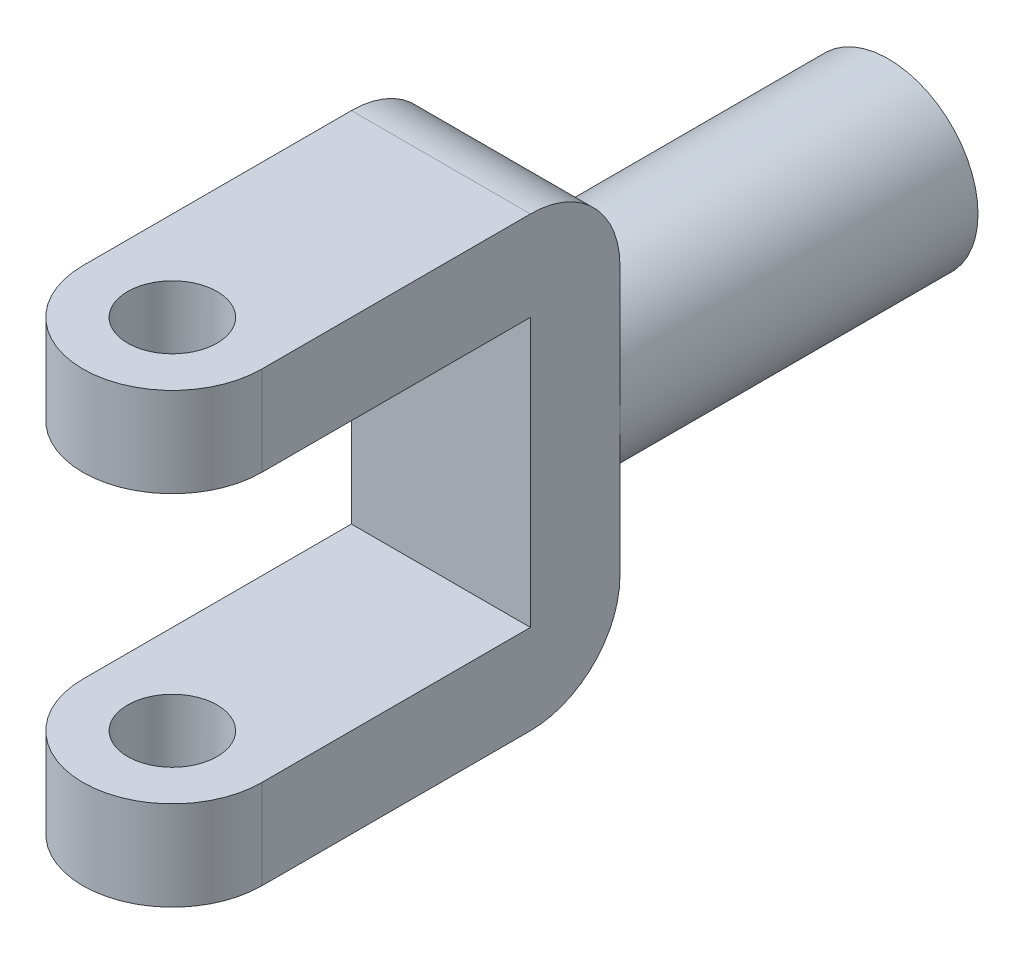
ISO-10303-21;
HEADER;
FILE_DESCRIPTION(('STEP AP214'),'2;1');
FILE_NAME('part.step','',(''),(''),'','','');
FILE_SCHEMA(('AUTOMOTIVE_DESIGN { 1 0 10303 214 1 1 1 1 }'));
ENDSEC;
DATA;
#1=APPLICATION_CONTEXT('core data for automotive mechanical design processes');
#2=APPLICATION_PROTOCOL_DEFINITION('international standard','automotive_design',2000,#1);
#3=PRODUCT_CONTEXT('',#1,'mechanical');
#4=PRODUCT('Part','Part','',(#3));
#5=PRODUCT_RELATED_PRODUCT_CATEGORY('part','',(#4));
#6=PRODUCT_DEFINITION_FORMATION('','',#4);
#7=PRODUCT_DEFINITION_CONTEXT('part definition',#1,'design');
#8=PRODUCT_DEFINITION('design','',#6,#7);
#9=PRODUCT_DEFINITION_SHAPE('','',#8);
#10=(LENGTH_UNIT() NAMED_UNIT(*) SI_UNIT(.MILLI.,.METRE.));
#11=(NAMED_UNIT(*) PLANE_ANGLE_UNIT() SI_UNIT($,.RADIAN.));
#12=(NAMED_UNIT(*) SI_UNIT($,.STERADIAN.) SOLID_ANGLE_UNIT());
#13=UNCERTAINTY_MEASURE_WITH_UNIT(LENGTH_MEASURE(1.E-05),#10,'distance_accuracy_value','');
#14=(GEOMETRIC_REPRESENTATION_CONTEXT(3) GLOBAL_UNCERTAINTY_ASSIGNED_CONTEXT((#13)) GLOBAL_UNIT_ASSIGNED_CONTEXT((#10,
#11,#12)) REPRESENTATION_CONTEXT('',''));
#15=CARTESIAN_POINT('',(0.,0.,0.));
#16=DIRECTION('',(0.,0.,1.));
#17=DIRECTION('',(1.,0.,0.));
#18=AXIS2_PLACEMENT_3D('',#15,#16,#17);
#19=CARTESIAN_POINT('',(5.,-7.5,25.));
#20=DIRECTION('',(-1.,0.,0.));
#21=DIRECTION('',(0.,0.,1.));
#22=AXIS2_PLACEMENT_3D('',#19,#20,#21);
#23=CYLINDRICAL_SURFACE('',#22,5.);
#24=DIRECTION('',(1.,0.,0.));
#25=VECTOR('',#24,1.);
#26=CARTESIAN_POINT('',(5.,-12.5,25.));
#27=LINE('',#26,#25);
#28=CARTESIAN_POINT('',(-5.,-12.5,25.));
#29=VERTEX_POINT('',#28);
#30=CARTESIAN_POINT('',(5.,-12.5,25.));
#31=VERTEX_POINT('',#30);
#32=EDGE_CURVE('E249',#29,#31,#27,.T.);
#33=ORIENTED_EDGE('',*,*,#32,.F.);
#34=CARTESIAN_POINT('',(-5.,-7.5,25.));
#35=DIRECTION('',(1.,0.,0.));
#36=DIRECTION('',(0.,0.,-1.));
#37=AXIS2_PLACEMENT_3D('',#34,#35,#36);
#38=CIRCLE('',#37,5.);
#39=CARTESIAN_POINT('',(-5.,-7.5,20.));
#40=VERTEX_POINT('',#39);
#41=EDGE_CURVE('E55',#40,#29,#38,.F.);
#42=ORIENTED_EDGE('',*,*,#41,.F.);
#43=DIRECTION('',(1.,0.,0.));
#44=VECTOR('',#43,1.);
#45=CARTESIAN_POINT('',(5.,-7.5,20.));
#46=LINE('',#45,#44);
#47=CARTESIAN_POINT('',(5.,-7.5,20.));
#48=VERTEX_POINT('',#47);
#49=EDGE_CURVE('E253',#48,#40,#46,.F.);
#50=ORIENTED_EDGE('',*,*,#49,.F.);
#51=CARTESIAN_POINT('',(5.,-7.5,25.));
#52=DIRECTION('',(-1.,0.,0.));
#53=DIRECTION('',(0.,-1.,0.));
#54=AXIS2_PLACEMENT_3D('',#51,#52,#53);
#55=CIRCLE('',#54,5.);
#56=EDGE_CURVE('E11',#31,#48,#55,.F.);
#57=ORIENTED_EDGE('',*,*,#56,.F.);
#58=EDGE_LOOP('',(#33,#42,#50,#57));
#59=FACE_BOUND('',#58,.T.);
#60=ADVANCED_FACE('F47',(#59),#23,.T.);
#61=CARTESIAN_POINT('',(-5.,7.5,25.));
#62=DIRECTION('',(1.,0.,0.));
#63=DIRECTION('',(0.,1.,0.));
#64=AXIS2_PLACEMENT_3D('',#61,#62,#63);
#65=CYLINDRICAL_SURFACE('',#64,5.);
#66=DIRECTION('',(-1.,0.,0.));
#67=VECTOR('',#66,1.);
#68=CARTESIAN_POINT('',(-5.,12.5,25.));
#69=LINE('',#68,#67);
#70=CARTESIAN_POINT('',(5.,12.5,25.));
#71=VERTEX_POINT('',#70);
#72=CARTESIAN_POINT('',(-5.,12.5,25.));
#73=VERTEX_POINT('',#72);
#74=EDGE_CURVE('E235',#71,#73,#69,.T.);
#75=ORIENTED_EDGE('',*,*,#74,.F.);
#76=CARTESIAN_POINT('',(5.,7.5,25.));
#77=DIRECTION('',(-1.,0.,0.));
#78=DIRECTION('',(0.,-1.,0.));
#79=AXIS2_PLACEMENT_3D('',#76,#77,#78);
#80=CIRCLE('',#79,5.);
#81=CARTESIAN_POINT('',(5.,7.5,20.));
#82=VERTEX_POINT('',#81);
#83=EDGE_CURVE('E243',#82,#71,#80,.F.);
#84=ORIENTED_EDGE('',*,*,#83,.F.);
#85=DIRECTION('',(-1.,0.,0.));
#86=VECTOR('',#85,1.);
#87=CARTESIAN_POINT('',(-5.,7.5,20.));
#88=LINE('',#87,#86);
#89=CARTESIAN_POINT('',(-5.,7.5,20.));
#90=VERTEX_POINT('',#89);
#91=EDGE_CURVE('E239',#90,#82,#88,.F.);
#92=ORIENTED_EDGE('',*,*,#91,.F.);
#93=CARTESIAN_POINT('',(-5.,7.5,25.));
#94=DIRECTION('',(1.,0.,0.));
#95=DIRECTION('',(0.,0.,-1.));
#96=AXIS2_PLACEMENT_3D('',#93,#94,#95);
#97=CIRCLE('',#96,5.);
#98=EDGE_CURVE('E246',#73,#90,#97,.F.);
#99=ORIENTED_EDGE('',*,*,#98,.F.);
#100=EDGE_LOOP('',(#75,#84,#92,#99));
#101=FACE_BOUND('',#100,.T.);
#102=ADVANCED_FACE('F290',(#101),#65,.T.);
#103=CARTESIAN_POINT('',(0.,-7.5,40.));
#104=DIRECTION('',(0.,1.,0.));
#105=DIRECTION('',(-1.,0.,0.));
#106=AXIS2_PLACEMENT_3D('',#103,#104,#105);
#107=CYLINDRICAL_SURFACE('',#106,5.);
#108=DIRECTION('',(0.,1.,0.));
#109=VECTOR('',#108,1.);
#110=CARTESIAN_POINT('',(5.,12.5,40.));
#111=LINE('',#110,#109);
#112=CARTESIAN_POINT('',(5.,-7.5,40.));
#113=VERTEX_POINT('',#112);
#114=CARTESIAN_POINT('',(5.,-12.5,40.));
#115=VERTEX_POINT('',#114);
#116=EDGE_CURVE('E221',#113,#115,#111,.F.);
#117=ORIENTED_EDGE('',*,*,#116,.F.);
#118=CARTESIAN_POINT('',(0.,-7.5,40.));
#119=DIRECTION('',(0.,-1.,0.));
#120=DIRECTION('',(0.,0.,-1.));
#121=AXIS2_PLACEMENT_3D('',#118,#119,#120);
#122=CIRCLE('',#121,5.);
#123=CARTESIAN_POINT('',(-5.,-7.5,40.));
#124=VERTEX_POINT('',#123);
#125=EDGE_CURVE('E229',#124,#113,#122,.F.);
#126=ORIENTED_EDGE('',*,*,#125,.F.);
#127=DIRECTION('',(0.,1.,0.));
#128=VECTOR('',#127,1.);
#129=CARTESIAN_POINT('',(-5.,0.,40.));
#130=LINE('',#129,#128);
#131=CARTESIAN_POINT('',(-5.,-12.5,40.));
#132=VERTEX_POINT('',#131);
#133=EDGE_CURVE('E225',#132,#124,#130,.T.);
#134=ORIENTED_EDGE('',*,*,#133,.F.);
#135=CARTESIAN_POINT('',(0.,-12.5,40.));
#136=DIRECTION('',(0.,1.,0.));
#137=DIRECTION('',(0.,0.,1.));
#138=AXIS2_PLACEMENT_3D('',#135,#136,#137);
#139=CIRCLE('',#138,5.);
#140=EDGE_CURVE('E232',#115,#132,#139,.F.);
#141=ORIENTED_EDGE('',*,*,#140,.F.);
#142=EDGE_LOOP('',(#117,#126,#134,#141));
#143=FACE_BOUND('',#142,.T.);
#144=ADVANCED_FACE('F267',(#143),#107,.T.);
#145=CARTESIAN_POINT('',(0.,12.5,40.));
#146=DIRECTION('',(0.,1.,0.));
#147=DIRECTION('',(-1.,0.,0.));
#148=AXIS2_PLACEMENT_3D('',#145,#146,#147);
#149=CYLINDRICAL_SURFACE('',#148,5.);
#150=DIRECTION('',(0.,-1.,0.));
#151=VECTOR('',#150,1.);
#152=CARTESIAN_POINT('',(5.,12.5,40.));
#153=LINE('',#152,#151);
#154=CARTESIAN_POINT('',(5.,12.5,40.));
#155=VERTEX_POINT('',#154);
#156=CARTESIAN_POINT('',(5.,7.5,40.));
#157=VERTEX_POINT('',#156);
#158=EDGE_CURVE('E134',#155,#157,#153,.T.);
#159=ORIENTED_EDGE('',*,*,#158,.F.);
#160=CARTESIAN_POINT('',(0.,12.5,40.));
#161=DIRECTION('',(0.,-1.,0.));
#162=DIRECTION('',(1.,0.,0.));
#163=AXIS2_PLACEMENT_3D('',#160,#161,#162);
#164=CIRCLE('',#163,5.);
#165=CARTESIAN_POINT('',(-5.,12.5,40.));
#166=VERTEX_POINT('',#165);
#167=EDGE_CURVE('E215',#166,#155,#164,.F.);
#168=ORIENTED_EDGE('',*,*,#167,.F.);
#169=DIRECTION('',(0.,-1.,0.));
#170=VECTOR('',#169,1.);
#171=CARTESIAN_POINT('',(-5.,12.5,40.));
#172=LINE('',#171,#170);
#173=CARTESIAN_POINT('',(-5.,7.5,40.));
#174=VERTEX_POINT('',#173);
#175=EDGE_CURVE('E211',#174,#166,#172,.F.);
#176=ORIENTED_EDGE('',*,*,#175,.F.);
#177=CARTESIAN_POINT('',(0.,7.5,40.));
#178=DIRECTION('',(0.,1.,0.));
#179=DIRECTION('',(0.,0.,1.));
#180=AXIS2_PLACEMENT_3D('',#177,#178,#179);
#181=CIRCLE('',#180,5.);
#182=EDGE_CURVE('E218',#157,#174,#181,.F.);
#183=ORIENTED_EDGE('',*,*,#182,.F.);
#184=EDGE_LOOP('',(#159,#168,#176,#183));
#185=FACE_BOUND('',#184,.T.);
#186=ADVANCED_FACE('F299',(#185),#149,.T.);
#187=CARTESIAN_POINT('',(0.,0.,25.));
#188=DIRECTION('',(0.,0.,-1.));
#189=DIRECTION('',(-1.,0.,0.));
#190=AXIS2_PLACEMENT_3D('',#187,#188,#189);
#191=PLANE('',#190);
#192=DIRECTION('',(1.,0.,0.));
#193=VECTOR('',#192,1.);
#194=CARTESIAN_POINT('',(-5.,7.5,25.));
#195=LINE('',#194,#193);
#196=CARTESIAN_POINT('',(-5.,7.5,25.));
#197=VERTEX_POINT('',#196);
#198=CARTESIAN_POINT('',(5.,7.5,25.));
#199=VERTEX_POINT('',#198);
#200=EDGE_CURVE('E139',#197,#199,#195,.T.);
#201=ORIENTED_EDGE('',*,*,#200,.F.);
#202=DIRECTION('',(0.,-1.,0.));
#203=VECTOR('',#202,1.);
#204=CARTESIAN_POINT('',(-5.,-12.5,25.));
#205=LINE('',#204,#203);
#206=CARTESIAN_POINT('',(-5.,-7.5,25.));
#207=VERTEX_POINT('',#206);
#208=EDGE_CURVE('E151',#197,#207,#205,.T.);
#209=ORIENTED_EDGE('',*,*,#208,.T.);
#210=DIRECTION('',(-1.,0.,0.));
#211=VECTOR('',#210,1.);
#212=CARTESIAN_POINT('',(-5.,-7.5,25.));
#213=LINE('',#212,#211);
#214=CARTESIAN_POINT('',(5.,-7.5,25.));
#215=VERTEX_POINT('',#214);
#216=EDGE_CURVE('E148',#215,#207,#213,.T.);
#217=ORIENTED_EDGE('',*,*,#216,.F.);
#218=DIRECTION('',(0.,1.,0.));
#219=VECTOR('',#218,1.);
#220=CARTESIAN_POINT('',(5.,12.5,25.));
#221=LINE('',#220,#219);
#222=EDGE_CURVE('E131',#215,#199,#221,.T.);
#223=ORIENTED_EDGE('',*,*,#222,.T.);
#224=EDGE_LOOP('',(#201,#209,#217,#223));
#225=FACE_BOUND('',#224,.T.);
#226=ADVANCED_FACE('F144',(#225),#191,.F.);
#227=CARTESIAN_POINT('',(0.,0.,20.));
#228=DIRECTION('',(0.,0.,-1.));
#229=DIRECTION('',(-1.,0.,0.));
#230=AXIS2_PLACEMENT_3D('',#227,#228,#229);
#231=CYLINDRICAL_SURFACE('',#230,5.);
#232=CARTESIAN_POINT('',(0.,0.,20.));
#233=DIRECTION('',(0.,0.,1.));
#234=DIRECTION('',(1.,0.,0.));
#235=AXIS2_PLACEMENT_3D('',#232,#233,#234);
#236=CIRCLE('',#235,5.);
#237=CARTESIAN_POINT('',(5.,0.,20.));
#238=VERTEX_POINT('',#237);
#239=CARTESIAN_POINT('',(-5.,0.,20.));
#240=VERTEX_POINT('',#239);
#241=EDGE_CURVE('E196',#238,#240,#236,.T.);
#242=ORIENTED_EDGE('',*,*,#241,.F.);
#243=EDGE_CURVE('E200',#240,#238,#236,.T.);
#244=ORIENTED_EDGE('',*,*,#243,.F.);
#245=EDGE_LOOP('',(#242,#244));
#246=FACE_BOUND('',#245,.T.);
#247=CARTESIAN_POINT('',(0.,0.,0.));
#248=DIRECTION('',(0.,0.,1.));
#249=DIRECTION('',(1.,0.,0.));
#250=AXIS2_PLACEMENT_3D('',#247,#248,#249);
#251=CIRCLE('',#250,5.);
#252=CARTESIAN_POINT('',(5.,0.,0.));
#253=VERTEX_POINT('',#252);
#254=EDGE_CURVE('E195',#253,#253,#251,.T.);
#255=ORIENTED_EDGE('',*,*,#254,.T.);
#256=EDGE_LOOP('',(#255));
#257=FACE_BOUND('',#256,.T.);
#258=ADVANCED_FACE('F312',(#246,#257),#231,.T.);
#259=CARTESIAN_POINT('',(0.,0.,0.));
#260=DIRECTION('',(0.,0.,1.));
#261=DIRECTION('',(1.,0.,0.));
#262=AXIS2_PLACEMENT_3D('',#259,#260,#261);
#263=PLANE('',#262);
#264=ORIENTED_EDGE('',*,*,#254,.F.);
#265=EDGE_LOOP('',(#264));
#266=FACE_BOUND('',#265,.T.);
#267=ADVANCED_FACE('F315',(#266),#263,.F.);
#268=CARTESIAN_POINT('',(0.,0.,20.));
#269=DIRECTION('',(0.,0.,-1.));
#270=DIRECTION('',(-1.,0.,0.));
#271=AXIS2_PLACEMENT_3D('',#268,#269,#270);
#272=PLANE('',#271);
#273=DIRECTION('',(0.,-1.,0.));
#274=VECTOR('',#273,1.);
#275=CARTESIAN_POINT('',(-5.,0.,20.));
#276=LINE('',#275,#274);
#277=EDGE_CURVE('E173',#90,#240,#276,.T.);
#278=ORIENTED_EDGE('',*,*,#277,.F.);
#279=ORIENTED_EDGE('',*,*,#91,.T.);
#280=DIRECTION('',(0.,1.,0.));
#281=VECTOR('',#280,1.);
#282=CARTESIAN_POINT('',(5.,12.5,20.));
#283=LINE('',#282,#281);
#284=EDGE_CURVE('E166',#238,#82,#283,.T.);
#285=ORIENTED_EDGE('',*,*,#284,.F.);
#286=ORIENTED_EDGE('',*,*,#241,.T.);
#287=EDGE_LOOP('',(#278,#279,#285,#286));
#288=FACE_BOUND('',#287,.T.);
#289=ADVANCED_FACE('F286',(#288),#272,.T.);
#290=CARTESIAN_POINT('',(5.,-12.5,25.));
#291=DIRECTION('',(0.,1.,0.));
#292=DIRECTION('',(0.,0.,1.));
#293=AXIS2_PLACEMENT_3D('',#290,#291,#292);
#294=PLANE('',#293);
#295=CARTESIAN_POINT('',(0.,-12.5,40.));
#296=DIRECTION('',(0.,1.,0.));
#297=DIRECTION('',(-1.,0.,0.));
#298=AXIS2_PLACEMENT_3D('',#295,#296,#297);
#299=CIRCLE('',#298,2.5);
#300=CARTESIAN_POINT('',(-2.5,-12.5,40.));
#301=VERTEX_POINT('',#300);
#302=EDGE_CURVE('E208',#301,#301,#299,.T.);
#303=ORIENTED_EDGE('',*,*,#302,.T.);
#304=EDGE_LOOP('',(#303));
#305=FACE_BOUND('',#304,.T.);
#306=DIRECTION('',(0.,0.,-1.));
#307=VECTOR('',#306,1.);
#308=CARTESIAN_POINT('',(-5.,-12.5,25.));
#309=LINE('',#308,#307);
#310=EDGE_CURVE('E191',#132,#29,#309,.T.);
#311=ORIENTED_EDGE('',*,*,#310,.T.);
#312=ORIENTED_EDGE('',*,*,#32,.T.);
#313=DIRECTION('',(0.,0.,-1.));
#314=VECTOR('',#313,1.);
#315=CARTESIAN_POINT('',(5.,-12.5,25.));
#316=LINE('',#315,#314);
#317=EDGE_CURVE('E188',#115,#31,#316,.T.);
#318=ORIENTED_EDGE('',*,*,#317,.F.);
#319=ORIENTED_EDGE('',*,*,#140,.T.);
#320=EDGE_LOOP('',(#311,#312,#318,#319));
#321=FACE_BOUND('',#320,.T.);
#322=ADVANCED_FACE('F263',(#305,#321),#294,.F.);
#323=CARTESIAN_POINT('',(5.,12.5,25.));
#324=DIRECTION('',(-1.,0.,0.));
#325=DIRECTION('',(0.,-1.,0.));
#326=AXIS2_PLACEMENT_3D('',#323,#324,#325);
#327=PLANE('',#326);
#328=ORIENTED_EDGE('',*,*,#317,.T.);
#329=ORIENTED_EDGE('',*,*,#56,.T.);
#330=EDGE_CURVE('E175',#48,#238,#283,.T.);
#331=ORIENTED_EDGE('',*,*,#330,.T.);
#332=ORIENTED_EDGE('',*,*,#284,.T.);
#333=ORIENTED_EDGE('',*,*,#83,.T.);
#334=DIRECTION('',(0.,0.,-1.));
#335=VECTOR('',#334,1.);
#336=CARTESIAN_POINT('',(5.,12.5,25.));
#337=LINE('',#336,#335);
#338=EDGE_CURVE('E184',#155,#71,#337,.T.);
#339=ORIENTED_EDGE('',*,*,#338,.F.);
#340=ORIENTED_EDGE('',*,*,#158,.T.);
#341=DIRECTION('',(0.,0.,-1.));
#342=VECTOR('',#341,1.);
#343=CARTESIAN_POINT('',(5.,7.5,45.));
#344=LINE('',#343,#342);
#345=EDGE_CURVE('E127',#157,#199,#344,.T.);
#346=ORIENTED_EDGE('',*,*,#345,.T.);
#347=ORIENTED_EDGE('',*,*,#222,.F.);
#348=DIRECTION('',(0.,0.,-1.));
#349=VECTOR('',#348,1.);
#350=CARTESIAN_POINT('',(5.,-7.5,45.));
#351=LINE('',#350,#349);
#352=EDGE_CURVE('E167',#113,#215,#351,.T.);
#353=ORIENTED_EDGE('',*,*,#352,.F.);
#354=ORIENTED_EDGE('',*,*,#116,.T.);
#355=EDGE_LOOP('',(#328,#329,#331,#332,#333,#339,#340,#346,#347,#353,#354));
#356=FACE_BOUND('',#355,.T.);
#357=ADVANCED_FACE('F129',(#356),#327,.F.);
#358=CARTESIAN_POINT('',(-5.,12.5,25.));
#359=DIRECTION('',(0.,-1.,0.));
#360=DIRECTION('',(1.,0.,0.));
#361=AXIS2_PLACEMENT_3D('',#358,#359,#360);
#362=PLANE('',#361);
#363=CARTESIAN_POINT('',(0.,12.5,40.));
#364=DIRECTION('',(0.,1.,0.));
#365=DIRECTION('',(-1.,0.,0.));
#366=AXIS2_PLACEMENT_3D('',#363,#364,#365);
#367=CIRCLE('',#366,2.5);
#368=CARTESIAN_POINT('',(-2.5,12.5,40.));
#369=VERTEX_POINT('',#368);
#370=EDGE_CURVE('E472',#369,#369,#367,.T.);
#371=ORIENTED_EDGE('',*,*,#370,.F.);
#372=EDGE_LOOP('',(#371));
#373=FACE_BOUND('',#372,.T.);
#374=ORIENTED_EDGE('',*,*,#338,.T.);
#375=ORIENTED_EDGE('',*,*,#74,.T.);
#376=DIRECTION('',(0.,0.,-1.));
#377=VECTOR('',#376,1.);
#378=CARTESIAN_POINT('',(-5.,12.5,25.));
#379=LINE('',#378,#377);
#380=EDGE_CURVE('E150',#166,#73,#379,.T.);
#381=ORIENTED_EDGE('',*,*,#380,.F.);
#382=ORIENTED_EDGE('',*,*,#167,.T.);
#383=EDGE_LOOP('',(#374,#375,#381,#382));
#384=FACE_BOUND('',#383,.T.);
#385=ADVANCED_FACE('F324',(#373,#384),#362,.F.);
#386=CARTESIAN_POINT('',(-5.,0.,25.));
#387=DIRECTION('',(1.,0.,0.));
#388=DIRECTION('',(0.,0.,-1.));
#389=AXIS2_PLACEMENT_3D('',#386,#387,#388);
#390=PLANE('',#389);
#391=EDGE_CURVE('E178',#240,#40,#276,.T.);
#392=ORIENTED_EDGE('',*,*,#391,.T.);
#393=ORIENTED_EDGE('',*,*,#41,.T.);
#394=ORIENTED_EDGE('',*,*,#310,.F.);
#395=ORIENTED_EDGE('',*,*,#133,.T.);
#396=DIRECTION('',(0.,0.,-1.));
#397=VECTOR('',#396,1.);
#398=CARTESIAN_POINT('',(-5.,-7.5,45.));
#399=LINE('',#398,#397);
#400=EDGE_CURVE('E158',#124,#207,#399,.T.);
#401=ORIENTED_EDGE('',*,*,#400,.T.);
#402=ORIENTED_EDGE('',*,*,#208,.F.);
#403=DIRECTION('',(0.,0.,-1.));
#404=VECTOR('',#403,1.);
#405=CARTESIAN_POINT('',(-5.,7.5,45.));
#406=LINE('',#405,#404);
#407=EDGE_CURVE('E138',#174,#197,#406,.T.);
#408=ORIENTED_EDGE('',*,*,#407,.F.);
#409=ORIENTED_EDGE('',*,*,#175,.T.);
#410=ORIENTED_EDGE('',*,*,#380,.T.);
#411=ORIENTED_EDGE('',*,*,#98,.T.);
#412=ORIENTED_EDGE('',*,*,#277,.T.);
#413=EDGE_LOOP('',(#392,#393,#394,#395,#401,#402,#408,#409,#410,#411,#412));
#414=FACE_BOUND('',#413,.T.);
#415=ADVANCED_FACE('F259',(#414),#390,.F.);
#416=ORIENTED_EDGE('',*,*,#330,.F.);
#417=ORIENTED_EDGE('',*,*,#49,.T.);
#418=ORIENTED_EDGE('',*,*,#391,.F.);
#419=ORIENTED_EDGE('',*,*,#243,.T.);
#420=EDGE_LOOP('',(#416,#417,#418,#419));
#421=FACE_BOUND('',#420,.T.);
#422=ADVANCED_FACE('F272',(#421),#272,.T.);
#423=CARTESIAN_POINT('',(-5.,-7.5,45.));
#424=DIRECTION('',(0.,-1.,0.));
#425=DIRECTION('',(0.,0.,-1.));
#426=AXIS2_PLACEMENT_3D('',#423,#424,#425);
#427=PLANE('',#426);
#428=CARTESIAN_POINT('',(0.,-7.5,40.));
#429=DIRECTION('',(0.,-1.,0.));
#430=DIRECTION('',(0.,0.,-1.));
#431=AXIS2_PLACEMENT_3D('',#428,#429,#430);
#432=CIRCLE('',#431,2.5);
#433=CARTESIAN_POINT('',(0.,-7.5,37.5));
#434=VERTEX_POINT('',#433);
#435=EDGE_CURVE('E161',#434,#434,#432,.T.);
#436=ORIENTED_EDGE('',*,*,#435,.T.);
#437=EDGE_LOOP('',(#436));
#438=FACE_BOUND('',#437,.T.);
#439=ORIENTED_EDGE('',*,*,#400,.F.);
#440=ORIENTED_EDGE('',*,*,#125,.T.);
#441=ORIENTED_EDGE('',*,*,#352,.T.);
#442=ORIENTED_EDGE('',*,*,#216,.T.);
#443=EDGE_LOOP('',(#439,#440,#441,#442));
#444=FACE_BOUND('',#443,.T.);
#445=ADVANCED_FACE('F270',(#438,#444),#427,.F.);
#446=CARTESIAN_POINT('',(-5.,7.5,45.));
#447=DIRECTION('',(0.,1.,0.));
#448=DIRECTION('',(0.,0.,1.));
#449=AXIS2_PLACEMENT_3D('',#446,#447,#448);
#450=PLANE('',#449);
#451=CARTESIAN_POINT('',(0.,7.5,40.));
#452=DIRECTION('',(0.,1.,0.));
#453=DIRECTION('',(0.,0.,1.));
#454=AXIS2_PLACEMENT_3D('',#451,#452,#453);
#455=CIRCLE('',#454,2.5);
#456=CARTESIAN_POINT('',(0.,7.5,42.5));
#457=VERTEX_POINT('',#456);
#458=EDGE_CURVE('E204',#457,#457,#455,.T.);
#459=ORIENTED_EDGE('',*,*,#458,.T.);
#460=EDGE_LOOP('',(#459));
#461=FACE_BOUND('',#460,.T.);
#462=ORIENTED_EDGE('',*,*,#345,.F.);
#463=ORIENTED_EDGE('',*,*,#182,.T.);
#464=ORIENTED_EDGE('',*,*,#407,.T.);
#465=ORIENTED_EDGE('',*,*,#200,.T.);
#466=EDGE_LOOP('',(#462,#463,#464,#465));
#467=FACE_BOUND('',#466,.T.);
#468=ADVANCED_FACE('F153',(#461,#467),#450,.F.);
#469=CARTESIAN_POINT('',(0.,-12.5,40.));
#470=DIRECTION('',(0.,1.,0.));
#471=DIRECTION('',(-1.,0.,0.));
#472=AXIS2_PLACEMENT_3D('',#469,#470,#471);
#473=CYLINDRICAL_SURFACE('',#472,2.5);
#474=ORIENTED_EDGE('',*,*,#370,.T.);
#475=EDGE_LOOP('',(#474));
#476=FACE_BOUND('',#475,.T.);
#477=ORIENTED_EDGE('',*,*,#458,.F.);
#478=EDGE_LOOP('',(#477));
#479=FACE_BOUND('',#478,.T.);
#480=ADVANCED_FACE('F280',(#476,#479),#473,.F.);
#481=ORIENTED_EDGE('',*,*,#302,.F.);
#482=EDGE_LOOP('',(#481));
#483=FACE_BOUND('',#482,.T.);
#484=ORIENTED_EDGE('',*,*,#435,.F.);
#485=EDGE_LOOP('',(#484));
#486=FACE_BOUND('',#485,.T.);
#487=ADVANCED_FACE('F342',(#483,#486),#473,.F.);
#488=CLOSED_SHELL('',(#60,#102,#144,#186,#226,#258,#267,#289,#322,#357,#385,#415,#422,#445,#468,
#480,#487));
#489=MANIFOLD_SOLID_BREP('B2',#488);
#490=ADVANCED_BREP_SHAPE_REPRESENTATION('',(#18,#489),#14);
#491=SHAPE_DEFINITION_REPRESENTATION(#9,#490);
ENDSEC;
END-ISO-10303-21;
